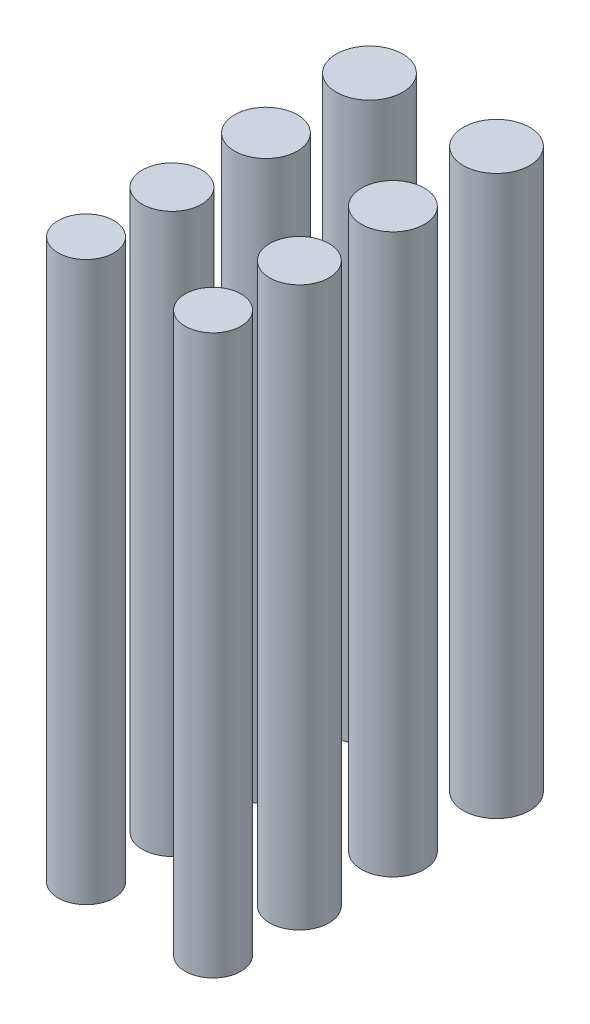
ISO-10303-21;
HEADER;
FILE_DESCRIPTION(('STEP AP214'),'2;1');
FILE_NAME('part.step','',(''),(''),'','','');
FILE_SCHEMA(('AUTOMOTIVE_DESIGN { 1 0 10303 214 1 1 1 1 }'));
ENDSEC;
DATA;
#1=APPLICATION_CONTEXT('core data for automotive mechanical design processes');
#2=APPLICATION_PROTOCOL_DEFINITION('international standard','automotive_design',2000,#1);
#3=PRODUCT_CONTEXT('',#1,'mechanical');
#4=PRODUCT('Part','Part','',(#3));
#5=PRODUCT_RELATED_PRODUCT_CATEGORY('part','',(#4));
#6=PRODUCT_DEFINITION_FORMATION('','',#4);
#7=PRODUCT_DEFINITION_CONTEXT('part definition',#1,'design');
#8=PRODUCT_DEFINITION('design','',#6,#7);
#9=PRODUCT_DEFINITION_SHAPE('','',#8);
#10=(LENGTH_UNIT() NAMED_UNIT(*) SI_UNIT(.MILLI.,.METRE.));
#11=(NAMED_UNIT(*) PLANE_ANGLE_UNIT() SI_UNIT($,.RADIAN.));
#12=(NAMED_UNIT(*) SI_UNIT($,.STERADIAN.) SOLID_ANGLE_UNIT());
#13=UNCERTAINTY_MEASURE_WITH_UNIT(LENGTH_MEASURE(1.E-05),#10,'distance_accuracy_value','');
#14=(GEOMETRIC_REPRESENTATION_CONTEXT(3) GLOBAL_UNCERTAINTY_ASSIGNED_CONTEXT((#13)) GLOBAL_UNIT_ASSIGNED_CONTEXT((#10,
#11,#12)) REPRESENTATION_CONTEXT('',''));
#15=CARTESIAN_POINT('',(0.,0.,0.));
#16=DIRECTION('',(0.,0.,1.));
#17=DIRECTION('',(1.,0.,0.));
#18=AXIS2_PLACEMENT_3D('',#15,#16,#17);
#19=CARTESIAN_POINT('',(-43.8962801830914,16.,-26.0497205236428));
#20=DIRECTION('',(0.,-1.,0.));
#21=DIRECTION('',(0.,0.,-1.));
#22=AXIS2_PLACEMENT_3D('',#19,#20,#21);
#23=CYLINDRICAL_SURFACE('',#22,0.950000000000001);
#24=CARTESIAN_POINT('',(-43.8962801830914,16.,-26.0497205236428));
#25=DIRECTION('',(0.,1.,0.));
#26=DIRECTION('',(0.,0.,1.));
#27=AXIS2_PLACEMENT_3D('',#24,#25,#26);
#28=CIRCLE('',#27,0.950000000000001);
#29=CARTESIAN_POINT('',(-43.8962801830914,16.,-25.0997205236428));
#30=VERTEX_POINT('',#29);
#31=EDGE_CURVE('E56',#30,#30,#28,.T.);
#32=ORIENTED_EDGE('',*,*,#31,.F.);
#33=EDGE_LOOP('',(#32));
#34=FACE_BOUND('',#33,.T.);
#35=CARTESIAN_POINT('',(-43.8962801830914,0.,-26.0497205236428));
#36=DIRECTION('',(0.,1.,0.));
#37=DIRECTION('',(0.,0.,1.));
#38=AXIS2_PLACEMENT_3D('',#35,#36,#37);
#39=CIRCLE('',#38,0.950000000000001);
#40=CARTESIAN_POINT('',(-43.8962801830914,0.,-25.0997205236428));
#41=VERTEX_POINT('',#40);
#42=EDGE_CURVE('E11',#41,#41,#39,.T.);
#43=ORIENTED_EDGE('',*,*,#42,.T.);
#44=EDGE_LOOP('',(#43));
#45=FACE_BOUND('',#44,.T.);
#46=ADVANCED_FACE('F52',(#34,#45),#23,.T.);
#47=CARTESIAN_POINT('',(-43.8962801830914,16.,-26.0497205236428));
#48=DIRECTION('',(0.,1.,0.));
#49=DIRECTION('',(0.,0.,1.));
#50=AXIS2_PLACEMENT_3D('',#47,#48,#49);
#51=PLANE('',#50);
#52=ORIENTED_EDGE('',*,*,#31,.T.);
#53=EDGE_LOOP('',(#52));
#54=FACE_BOUND('',#53,.T.);
#55=ADVANCED_FACE('F54',(#54),#51,.T.);
#56=CARTESIAN_POINT('',(-43.8962801830914,0.,-26.0497205236428));
#57=DIRECTION('',(0.,1.,0.));
#58=DIRECTION('',(0.,0.,1.));
#59=AXIS2_PLACEMENT_3D('',#56,#57,#58);
#60=PLANE('',#59);
#61=ORIENTED_EDGE('',*,*,#42,.F.);
#62=EDGE_LOOP('',(#61));
#63=FACE_BOUND('',#62,.T.);
#64=ADVANCED_FACE('F71',(#63),#60,.F.);
#65=CLOSED_SHELL('',(#46,#55,#64));
#66=MANIFOLD_SOLID_BREP('B2',#65);
#67=CARTESIAN_POINT('',(-47.5330900659438,16.,-26.0497205236428));
#68=DIRECTION('',(0.,-1.,0.));
#69=DIRECTION('',(0.,0.,-1.));
#70=AXIS2_PLACEMENT_3D('',#67,#68,#69);
#71=CYLINDRICAL_SURFACE('',#70,0.950000000000001);
#72=CARTESIAN_POINT('',(-47.5330900659438,16.,-26.0497205236428));
#73=DIRECTION('',(0.,1.,0.));
#74=DIRECTION('',(0.,0.,1.));
#75=AXIS2_PLACEMENT_3D('',#72,#73,#74);
#76=CIRCLE('',#75,0.950000000000001);
#77=CARTESIAN_POINT('',(-47.5330900659438,16.,-25.0997205236428));
#78=VERTEX_POINT('',#77);
#79=EDGE_CURVE('E105',#78,#78,#76,.T.);
#80=ORIENTED_EDGE('',*,*,#79,.F.);
#81=EDGE_LOOP('',(#80));
#82=FACE_BOUND('',#81,.T.);
#83=CARTESIAN_POINT('',(-47.5330900659438,0.,-26.0497205236428));
#84=DIRECTION('',(0.,1.,0.));
#85=DIRECTION('',(0.,0.,1.));
#86=AXIS2_PLACEMENT_3D('',#83,#84,#85);
#87=CIRCLE('',#86,0.950000000000001);
#88=CARTESIAN_POINT('',(-47.5330900659438,0.,-25.0997205236428));
#89=VERTEX_POINT('',#88);
#90=EDGE_CURVE('E51',#89,#89,#87,.T.);
#91=ORIENTED_EDGE('',*,*,#90,.T.);
#92=EDGE_LOOP('',(#91));
#93=FACE_BOUND('',#92,.T.);
#94=ADVANCED_FACE('F101',(#82,#93),#71,.T.);
#95=CARTESIAN_POINT('',(-47.5330900659438,16.,-26.0497205236428));
#96=DIRECTION('',(0.,1.,0.));
#97=DIRECTION('',(0.,0.,1.));
#98=AXIS2_PLACEMENT_3D('',#95,#96,#97);
#99=PLANE('',#98);
#100=ORIENTED_EDGE('',*,*,#79,.T.);
#101=EDGE_LOOP('',(#100));
#102=FACE_BOUND('',#101,.T.);
#103=ADVANCED_FACE('F103',(#102),#99,.T.);
#104=CARTESIAN_POINT('',(-47.5330900659438,0.,-26.0497205236428));
#105=DIRECTION('',(0.,1.,0.));
#106=DIRECTION('',(0.,0.,1.));
#107=AXIS2_PLACEMENT_3D('',#104,#105,#106);
#108=PLANE('',#107);
#109=ORIENTED_EDGE('',*,*,#90,.F.);
#110=EDGE_LOOP('',(#109));
#111=FACE_BOUND('',#110,.T.);
#112=ADVANCED_FACE('F122',(#111),#108,.F.);
#113=CLOSED_SHELL('',(#94,#103,#112));
#114=MANIFOLD_SOLID_BREP('B6',#113);
#115=CARTESIAN_POINT('',(-43.8962801830914,16.,-17.9321082771559));
#116=DIRECTION('',(0.,-1.,0.));
#117=DIRECTION('',(0.,0.,-1.));
#118=AXIS2_PLACEMENT_3D('',#115,#116,#117);
#119=CYLINDRICAL_SURFACE('',#118,0.800000000000002);
#120=CARTESIAN_POINT('',(-43.8962801830914,16.,-17.9321082771559));
#121=DIRECTION('',(0.,1.,0.));
#122=DIRECTION('',(0.,0.,1.));
#123=AXIS2_PLACEMENT_3D('',#120,#121,#122);
#124=CIRCLE('',#123,0.800000000000002);
#125=CARTESIAN_POINT('',(-43.8962801830914,16.,-17.1321082771559));
#126=VERTEX_POINT('',#125);
#127=EDGE_CURVE('E156',#126,#126,#124,.T.);
#128=ORIENTED_EDGE('',*,*,#127,.F.);
#129=EDGE_LOOP('',(#128));
#130=FACE_BOUND('',#129,.T.);
#131=CARTESIAN_POINT('',(-43.8962801830914,0.,-17.9321082771559));
#132=DIRECTION('',(0.,1.,0.));
#133=DIRECTION('',(0.,0.,1.));
#134=AXIS2_PLACEMENT_3D('',#131,#132,#133);
#135=CIRCLE('',#134,0.800000000000002);
#136=CARTESIAN_POINT('',(-43.8962801830914,0.,-17.1321082771559));
#137=VERTEX_POINT('',#136);
#138=EDGE_CURVE('E100',#137,#137,#135,.T.);
#139=ORIENTED_EDGE('',*,*,#138,.T.);
#140=EDGE_LOOP('',(#139));
#141=FACE_BOUND('',#140,.T.);
#142=ADVANCED_FACE('F152',(#130,#141),#119,.T.);
#143=CARTESIAN_POINT('',(-43.8962801830914,16.,-17.9321082771559));
#144=DIRECTION('',(0.,1.,0.));
#145=DIRECTION('',(0.,0.,1.));
#146=AXIS2_PLACEMENT_3D('',#143,#144,#145);
#147=PLANE('',#146);
#148=ORIENTED_EDGE('',*,*,#127,.T.);
#149=EDGE_LOOP('',(#148));
#150=FACE_BOUND('',#149,.T.);
#151=ADVANCED_FACE('F154',(#150),#147,.T.);
#152=CARTESIAN_POINT('',(-43.8962801830914,0.,-17.9321082771559));
#153=DIRECTION('',(0.,1.,0.));
#154=DIRECTION('',(0.,0.,1.));
#155=AXIS2_PLACEMENT_3D('',#152,#153,#154);
#156=PLANE('',#155);
#157=ORIENTED_EDGE('',*,*,#138,.F.);
#158=EDGE_LOOP('',(#157));
#159=FACE_BOUND('',#158,.T.);
#160=ADVANCED_FACE('F171',(#159),#156,.F.);
#161=CLOSED_SHELL('',(#142,#151,#160));
#162=MANIFOLD_SOLID_BREP('B46',#161);
#163=CARTESIAN_POINT('',(-47.5330900659438,16.,-17.9321082771559));
#164=DIRECTION('',(0.,-1.,0.));
#165=DIRECTION('',(0.,0.,-1.));
#166=AXIS2_PLACEMENT_3D('',#163,#164,#165);
#167=CYLINDRICAL_SURFACE('',#166,0.799999999999995);
#168=CARTESIAN_POINT('',(-47.5330900659438,16.,-17.9321082771559));
#169=DIRECTION('',(0.,1.,0.));
#170=DIRECTION('',(0.,0.,1.));
#171=AXIS2_PLACEMENT_3D('',#168,#169,#170);
#172=CIRCLE('',#171,0.799999999999995);
#173=CARTESIAN_POINT('',(-47.5330900659438,16.,-17.1321082771559));
#174=VERTEX_POINT('',#173);
#175=EDGE_CURVE('E205',#174,#174,#172,.T.);
#176=ORIENTED_EDGE('',*,*,#175,.F.);
#177=EDGE_LOOP('',(#176));
#178=FACE_BOUND('',#177,.T.);
#179=CARTESIAN_POINT('',(-47.5330900659438,0.,-17.9321082771559));
#180=DIRECTION('',(0.,1.,0.));
#181=DIRECTION('',(0.,0.,1.));
#182=AXIS2_PLACEMENT_3D('',#179,#180,#181);
#183=CIRCLE('',#182,0.799999999999995);
#184=CARTESIAN_POINT('',(-47.5330900659438,0.,-17.1321082771559));
#185=VERTEX_POINT('',#184);
#186=EDGE_CURVE('E151',#185,#185,#183,.T.);
#187=ORIENTED_EDGE('',*,*,#186,.T.);
#188=EDGE_LOOP('',(#187));
#189=FACE_BOUND('',#188,.T.);
#190=ADVANCED_FACE('F201',(#178,#189),#167,.T.);
#191=CARTESIAN_POINT('',(-47.5330900659438,16.,-17.9321082771559));
#192=DIRECTION('',(0.,1.,0.));
#193=DIRECTION('',(0.,0.,1.));
#194=AXIS2_PLACEMENT_3D('',#191,#192,#193);
#195=PLANE('',#194);
#196=ORIENTED_EDGE('',*,*,#175,.T.);
#197=EDGE_LOOP('',(#196));
#198=FACE_BOUND('',#197,.T.);
#199=ADVANCED_FACE('F203',(#198),#195,.T.);
#200=CARTESIAN_POINT('',(-47.5330900659438,0.,-17.9321082771559));
#201=DIRECTION('',(0.,1.,0.));
#202=DIRECTION('',(0.,0.,1.));
#203=AXIS2_PLACEMENT_3D('',#200,#201,#202);
#204=PLANE('',#203);
#205=ORIENTED_EDGE('',*,*,#186,.F.);
#206=EDGE_LOOP('',(#205));
#207=FACE_BOUND('',#206,.T.);
#208=ADVANCED_FACE('F220',(#207),#204,.F.);
#209=CLOSED_SHELL('',(#190,#199,#208));
#210=MANIFOLD_SOLID_BREP('B95',#209);
#211=CARTESIAN_POINT('',(-43.88533649801,16.,-20.3928038862519));
#212=DIRECTION('',(0.,-1.,0.));
#213=DIRECTION('',(0.,0.,-1.));
#214=AXIS2_PLACEMENT_3D('',#211,#212,#213);
#215=CYLINDRICAL_SURFACE('',#214,0.85);
#216=CARTESIAN_POINT('',(-43.88533649801,16.,-20.3928038862519));
#217=DIRECTION('',(0.,1.,0.));
#218=DIRECTION('',(0.,0.,1.));
#219=AXIS2_PLACEMENT_3D('',#216,#217,#218);
#220=CIRCLE('',#219,0.85);
#221=CARTESIAN_POINT('',(-43.88533649801,16.,-19.5428038862519));
#222=VERTEX_POINT('',#221);
#223=EDGE_CURVE('E254',#222,#222,#220,.T.);
#224=ORIENTED_EDGE('',*,*,#223,.F.);
#225=EDGE_LOOP('',(#224));
#226=FACE_BOUND('',#225,.T.);
#227=CARTESIAN_POINT('',(-43.88533649801,0.,-20.3928038862519));
#228=DIRECTION('',(0.,1.,0.));
#229=DIRECTION('',(0.,0.,1.));
#230=AXIS2_PLACEMENT_3D('',#227,#228,#229);
#231=CIRCLE('',#230,0.85);
#232=CARTESIAN_POINT('',(-43.88533649801,0.,-19.5428038862519));
#233=VERTEX_POINT('',#232);
#234=EDGE_CURVE('E200',#233,#233,#231,.T.);
#235=ORIENTED_EDGE('',*,*,#234,.T.);
#236=EDGE_LOOP('',(#235));
#237=FACE_BOUND('',#236,.T.);
#238=ADVANCED_FACE('F250',(#226,#237),#215,.T.);
#239=CARTESIAN_POINT('',(-43.88533649801,16.,-20.3928038862519));
#240=DIRECTION('',(0.,1.,0.));
#241=DIRECTION('',(0.,0.,1.));
#242=AXIS2_PLACEMENT_3D('',#239,#240,#241);
#243=PLANE('',#242);
#244=ORIENTED_EDGE('',*,*,#223,.T.);
#245=EDGE_LOOP('',(#244));
#246=FACE_BOUND('',#245,.T.);
#247=ADVANCED_FACE('F252',(#246),#243,.T.);
#248=CARTESIAN_POINT('',(-43.88533649801,0.,-20.3928038862519));
#249=DIRECTION('',(0.,1.,0.));
#250=DIRECTION('',(0.,0.,1.));
#251=AXIS2_PLACEMENT_3D('',#248,#249,#250);
#252=PLANE('',#251);
#253=ORIENTED_EDGE('',*,*,#234,.F.);
#254=EDGE_LOOP('',(#253));
#255=FACE_BOUND('',#254,.T.);
#256=ADVANCED_FACE('F269',(#255),#252,.F.);
#257=CLOSED_SHELL('',(#238,#247,#256));
#258=MANIFOLD_SOLID_BREP('B146',#257);
#259=CARTESIAN_POINT('',(-47.5330900659438,16.,-20.3928038862519));
#260=DIRECTION('',(0.,-1.,0.));
#261=DIRECTION('',(0.,0.,-1.));
#262=AXIS2_PLACEMENT_3D('',#259,#260,#261);
#263=CYLINDRICAL_SURFACE('',#262,0.85);
#264=CARTESIAN_POINT('',(-47.5330900659438,16.,-20.3928038862519));
#265=DIRECTION('',(0.,1.,0.));
#266=DIRECTION('',(0.,0.,1.));
#267=AXIS2_PLACEMENT_3D('',#264,#265,#266);
#268=CIRCLE('',#267,0.85);
#269=CARTESIAN_POINT('',(-47.5330900659438,16.,-19.5428038862519));
#270=VERTEX_POINT('',#269);
#271=EDGE_CURVE('E303',#270,#270,#268,.T.);
#272=ORIENTED_EDGE('',*,*,#271,.F.);
#273=EDGE_LOOP('',(#272));
#274=FACE_BOUND('',#273,.T.);
#275=CARTESIAN_POINT('',(-47.5330900659438,0.,-20.3928038862519));
#276=DIRECTION('',(0.,1.,0.));
#277=DIRECTION('',(0.,0.,1.));
#278=AXIS2_PLACEMENT_3D('',#275,#276,#277);
#279=CIRCLE('',#278,0.85);
#280=CARTESIAN_POINT('',(-47.5330900659438,0.,-19.5428038862519));
#281=VERTEX_POINT('',#280);
#282=EDGE_CURVE('E249',#281,#281,#279,.T.);
#283=ORIENTED_EDGE('',*,*,#282,.T.);
#284=EDGE_LOOP('',(#283));
#285=FACE_BOUND('',#284,.T.);
#286=ADVANCED_FACE('F299',(#274,#285),#263,.T.);
#287=CARTESIAN_POINT('',(-47.5330900659438,16.,-20.3928038862519));
#288=DIRECTION('',(0.,1.,0.));
#289=DIRECTION('',(0.,0.,1.));
#290=AXIS2_PLACEMENT_3D('',#287,#288,#289);
#291=PLANE('',#290);
#292=ORIENTED_EDGE('',*,*,#271,.T.);
#293=EDGE_LOOP('',(#292));
#294=FACE_BOUND('',#293,.T.);
#295=ADVANCED_FACE('F301',(#294),#291,.T.);
#296=CARTESIAN_POINT('',(-47.5330900659438,0.,-20.3928038862519));
#297=DIRECTION('',(0.,1.,0.));
#298=DIRECTION('',(0.,0.,1.));
#299=AXIS2_PLACEMENT_3D('',#296,#297,#298);
#300=PLANE('',#299);
#301=ORIENTED_EDGE('',*,*,#282,.F.);
#302=EDGE_LOOP('',(#301));
#303=FACE_BOUND('',#302,.T.);
#304=ADVANCED_FACE('F318',(#303),#300,.F.);
#305=CLOSED_SHELL('',(#286,#295,#304));
#306=MANIFOLD_SOLID_BREP('B195',#305);
#307=CARTESIAN_POINT('',(-43.8962801830914,16.,-23.0838292975367));
#308=DIRECTION('',(0.,-1.,0.));
#309=DIRECTION('',(0.,0.,-1.));
#310=AXIS2_PLACEMENT_3D('',#307,#308,#309);
#311=CYLINDRICAL_SURFACE('',#310,0.900000000000004);
#312=CARTESIAN_POINT('',(-43.8962801830914,16.,-23.0838292975367));
#313=DIRECTION('',(0.,1.,0.));
#314=DIRECTION('',(0.,0.,1.));
#315=AXIS2_PLACEMENT_3D('',#312,#313,#314);
#316=CIRCLE('',#315,0.900000000000004);
#317=CARTESIAN_POINT('',(-43.8962801830914,16.,-22.1838292975367));
#318=VERTEX_POINT('',#317);
#319=EDGE_CURVE('E351',#318,#318,#316,.T.);
#320=ORIENTED_EDGE('',*,*,#319,.F.);
#321=EDGE_LOOP('',(#320));
#322=FACE_BOUND('',#321,.T.);
#323=CARTESIAN_POINT('',(-43.8962801830914,0.,-23.0838292975367));
#324=DIRECTION('',(0.,1.,0.));
#325=DIRECTION('',(0.,0.,1.));
#326=AXIS2_PLACEMENT_3D('',#323,#324,#325);
#327=CIRCLE('',#326,0.900000000000004);
#328=CARTESIAN_POINT('',(-43.8962801830914,0.,-22.1838292975367));
#329=VERTEX_POINT('',#328);
#330=EDGE_CURVE('E298',#329,#329,#327,.T.);
#331=ORIENTED_EDGE('',*,*,#330,.T.);
#332=EDGE_LOOP('',(#331));
#333=FACE_BOUND('',#332,.T.);
#334=ADVANCED_FACE('F347',(#322,#333),#311,.T.);
#335=CARTESIAN_POINT('',(-43.8962801830914,16.,-23.0838292975367));
#336=DIRECTION('',(0.,1.,0.));
#337=DIRECTION('',(0.,0.,1.));
#338=AXIS2_PLACEMENT_3D('',#335,#336,#337);
#339=PLANE('',#338);
#340=ORIENTED_EDGE('',*,*,#319,.T.);
#341=EDGE_LOOP('',(#340));
#342=FACE_BOUND('',#341,.T.);
#343=ADVANCED_FACE('F349',(#342),#339,.T.);
#344=CARTESIAN_POINT('',(-43.8962801830914,0.,-23.0838292975367));
#345=DIRECTION('',(0.,1.,0.));
#346=DIRECTION('',(0.,0.,1.));
#347=AXIS2_PLACEMENT_3D('',#344,#345,#346);
#348=PLANE('',#347);
#349=ORIENTED_EDGE('',*,*,#330,.F.);
#350=EDGE_LOOP('',(#349));
#351=FACE_BOUND('',#350,.T.);
#352=ADVANCED_FACE('F366',(#351),#348,.F.);
#353=CLOSED_SHELL('',(#334,#343,#352));
#354=MANIFOLD_SOLID_BREP('B244',#353);
#355=CARTESIAN_POINT('',(-47.5330900659438,16.,-23.0838292975367));
#356=DIRECTION('',(0.,-1.,0.));
#357=DIRECTION('',(0.,0.,-1.));
#358=AXIS2_PLACEMENT_3D('',#355,#356,#357);
#359=CYLINDRICAL_SURFACE('',#358,0.900000000000004);
#360=CARTESIAN_POINT('',(-47.5330900659438,16.,-23.0838292975367));
#361=DIRECTION('',(0.,1.,0.));
#362=DIRECTION('',(0.,0.,1.));
#363=AXIS2_PLACEMENT_3D('',#360,#361,#362);
#364=CIRCLE('',#363,0.900000000000004);
#365=CARTESIAN_POINT('',(-47.5330900659438,16.,-22.1838292975367));
#366=VERTEX_POINT('',#365);
#367=EDGE_CURVE('E346',#366,#366,#364,.T.);
#368=ORIENTED_EDGE('',*,*,#367,.F.);
#369=EDGE_LOOP('',(#368));
#370=FACE_BOUND('',#369,.T.);
#371=CARTESIAN_POINT('',(-47.5330900659438,0.,-23.0838292975367));
#372=DIRECTION('',(0.,1.,0.));
#373=DIRECTION('',(0.,0.,1.));
#374=AXIS2_PLACEMENT_3D('',#371,#372,#373);
#375=CIRCLE('',#374,0.900000000000004);
#376=CARTESIAN_POINT('',(-47.5330900659438,0.,-22.1838292975367));
#377=VERTEX_POINT('',#376);
#378=EDGE_CURVE('E391',#377,#377,#375,.T.);
#379=ORIENTED_EDGE('',*,*,#378,.T.);
#380=EDGE_LOOP('',(#379));
#381=FACE_BOUND('',#380,.T.);
#382=ADVANCED_FACE('F388',(#370,#381),#359,.T.);
#383=CARTESIAN_POINT('',(-47.5330900659438,16.,-23.0838292975367));
#384=DIRECTION('',(0.,1.,0.));
#385=DIRECTION('',(0.,0.,1.));
#386=AXIS2_PLACEMENT_3D('',#383,#384,#385);
#387=PLANE('',#386);
#388=ORIENTED_EDGE('',*,*,#367,.T.);
#389=EDGE_LOOP('',(#388));
#390=FACE_BOUND('',#389,.T.);
#391=ADVANCED_FACE('F403',(#390),#387,.T.);
#392=CARTESIAN_POINT('',(-47.5330900659438,0.,-23.0838292975367));
#393=DIRECTION('',(0.,1.,0.));
#394=DIRECTION('',(0.,0.,1.));
#395=AXIS2_PLACEMENT_3D('',#392,#393,#394);
#396=PLANE('',#395);
#397=ORIENTED_EDGE('',*,*,#378,.F.);
#398=EDGE_LOOP('',(#397));
#399=FACE_BOUND('',#398,.T.);
#400=ADVANCED_FACE('F401',(#399),#396,.F.);
#401=CLOSED_SHELL('',(#382,#391,#400));
#402=MANIFOLD_SOLID_BREP('B293',#401);
#403=ADVANCED_BREP_SHAPE_REPRESENTATION('',(#18,#66,#114,#162,#210,#258,#306,#354,#402),#14);
#404=SHAPE_DEFINITION_REPRESENTATION(#9,#403);
ENDSEC;
END-ISO-10303-21;
